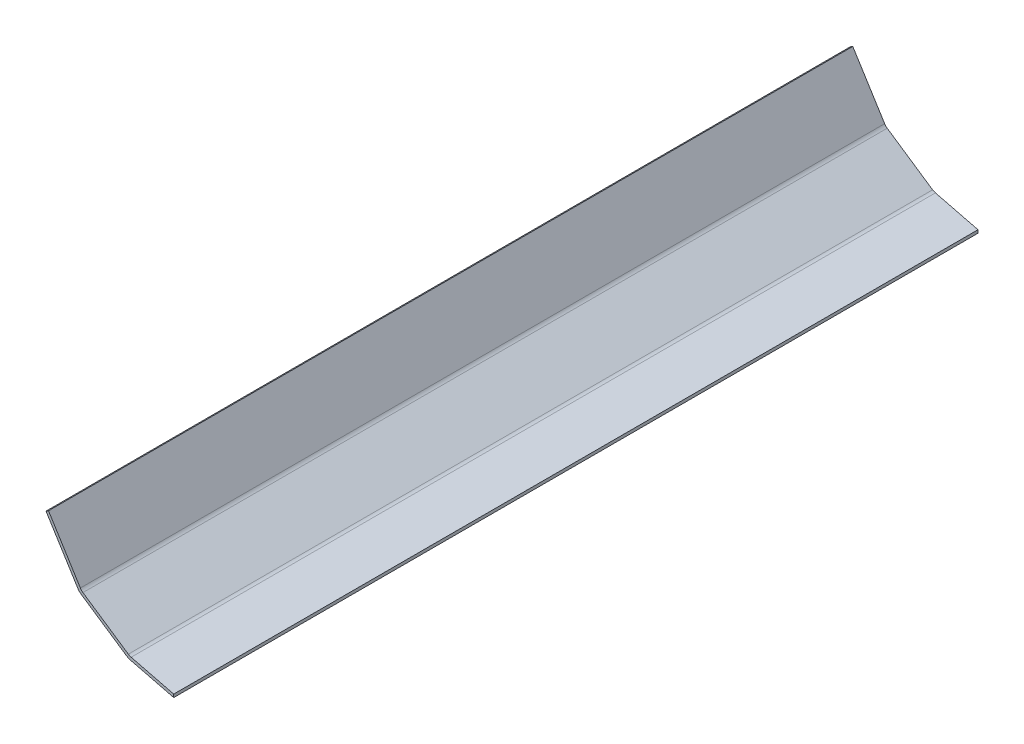
ISO-10303-21;
HEADER;
FILE_DESCRIPTION(('STEP AP214'),'2;1');
FILE_NAME('part.step','',(''),(''),'','','');
FILE_SCHEMA(('AUTOMOTIVE_DESIGN { 1 0 10303 214 1 1 1 1 }'));
ENDSEC;
DATA;
#1=APPLICATION_CONTEXT('core data for automotive mechanical design processes');
#2=APPLICATION_PROTOCOL_DEFINITION('international standard','automotive_design',2000,#1);
#3=PRODUCT_CONTEXT('',#1,'mechanical');
#4=PRODUCT('Part','Part','',(#3));
#5=PRODUCT_RELATED_PRODUCT_CATEGORY('part','',(#4));
#6=PRODUCT_DEFINITION_FORMATION('','',#4);
#7=PRODUCT_DEFINITION_CONTEXT('part definition',#1,'design');
#8=PRODUCT_DEFINITION('design','',#6,#7);
#9=PRODUCT_DEFINITION_SHAPE('','',#8);
#10=(LENGTH_UNIT() NAMED_UNIT(*) SI_UNIT(.MILLI.,.METRE.));
#11=(NAMED_UNIT(*) PLANE_ANGLE_UNIT() SI_UNIT($,.RADIAN.));
#12=(NAMED_UNIT(*) SI_UNIT($,.STERADIAN.) SOLID_ANGLE_UNIT());
#13=UNCERTAINTY_MEASURE_WITH_UNIT(LENGTH_MEASURE(1.E-05),#10,'distance_accuracy_value','');
#14=(GEOMETRIC_REPRESENTATION_CONTEXT(3) GLOBAL_UNCERTAINTY_ASSIGNED_CONTEXT((#13)) GLOBAL_UNIT_ASSIGNED_CONTEXT((#10,
#11,#12)) REPRESENTATION_CONTEXT('',''));
#15=CARTESIAN_POINT('',(0.,0.,0.));
#16=DIRECTION('',(0.,0.,1.));
#17=DIRECTION('',(1.,0.,0.));
#18=AXIS2_PLACEMENT_3D('',#15,#16,#17);
#19=CARTESIAN_POINT('',(135.5,2.060748754,272.));
#20=DIRECTION('',(-1.,0.,0.));
#21=DIRECTION('',(0.,0.,1.));
#22=AXIS2_PLACEMENT_3D('',#19,#20,#21);
#23=PLANE('',#22);
#24=DIRECTION('',(0.,1.,0.));
#25=VECTOR('',#24,1.);
#26=CARTESIAN_POINT('',(135.5,2.060748754,0.));
#27=LINE('',#26,#25);
#28=CARTESIAN_POINT('',(135.5,2.060748754,0.));
#29=VERTEX_POINT('',#28);
#30=CARTESIAN_POINT('',(135.5,3.091362383,0.));
#31=VERTEX_POINT('',#30);
#32=EDGE_CURVE('E172',#29,#31,#27,.T.);
#33=ORIENTED_EDGE('',*,*,#32,.T.);
#34=DIRECTION('',(0.,0.,-1.));
#35=VECTOR('',#34,1.);
#36=CARTESIAN_POINT('',(135.5,3.091362383,272.));
#37=LINE('',#36,#35);
#38=CARTESIAN_POINT('',(135.5,3.091362383,272.));
#39=VERTEX_POINT('',#38);
#40=EDGE_CURVE('E11',#39,#31,#37,.T.);
#41=ORIENTED_EDGE('',*,*,#40,.F.);
#42=DIRECTION('',(0.,1.,0.));
#43=VECTOR('',#42,1.);
#44=CARTESIAN_POINT('',(135.5,2.060748754,272.));
#45=LINE('',#44,#43);
#46=CARTESIAN_POINT('',(135.5,2.060748754,272.));
#47=VERTEX_POINT('',#46);
#48=EDGE_CURVE('E205',#47,#39,#45,.T.);
#49=ORIENTED_EDGE('',*,*,#48,.F.);
#50=DIRECTION('',(0.,0.,-1.));
#51=VECTOR('',#50,1.);
#52=CARTESIAN_POINT('',(135.5,2.060748754,272.));
#53=LINE('',#52,#51);
#54=EDGE_CURVE('E168',#47,#29,#53,.T.);
#55=ORIENTED_EDGE('',*,*,#54,.T.);
#56=EDGE_LOOP('',(#33,#41,#49,#55));
#57=FACE_BOUND('',#56,.T.);
#58=ADVANCED_FACE('F45',(#57),#23,.F.);
#59=CARTESIAN_POINT('',(135.5,3.091362383,272.));
#60=DIRECTION('',(-0.241921895633439,-0.970295726267577,0.));
#61=DIRECTION('',(0.970295726267577,-0.241921895633439,0.));
#62=AXIS2_PLACEMENT_3D('',#59,#60,#61);
#63=PLANE('',#62);
#64=DIRECTION('',(-0.970295726267577,0.241921895633439,0.));
#65=VECTOR('',#64,1.);
#66=CARTESIAN_POINT('',(135.5,3.091362383,0.));
#67=LINE('',#66,#65);
#68=CARTESIAN_POINT('',(121.100256736,6.681621613,0.));
#69=VERTEX_POINT('',#68);
#70=EDGE_CURVE('E176',#31,#69,#67,.T.);
#71=ORIENTED_EDGE('',*,*,#70,.T.);
#72=DIRECTION('',(0.,0.,-1.));
#73=VECTOR('',#72,1.);
#74=CARTESIAN_POINT('',(121.100256736,6.681621613,272.));
#75=LINE('',#74,#73);
#76=CARTESIAN_POINT('',(121.100256736,6.681621613,272.));
#77=VERTEX_POINT('',#76);
#78=EDGE_CURVE('E54',#77,#69,#75,.T.);
#79=ORIENTED_EDGE('',*,*,#78,.F.);
#80=DIRECTION('',(-0.970295726267577,0.241921895633439,0.));
#81=VECTOR('',#80,1.);
#82=CARTESIAN_POINT('',(135.5,3.091362383,272.));
#83=LINE('',#82,#81);
#84=EDGE_CURVE('E117',#39,#77,#83,.T.);
#85=ORIENTED_EDGE('',*,*,#84,.F.);
#86=ORIENTED_EDGE('',*,*,#40,.T.);
#87=EDGE_LOOP('',(#71,#79,#85,#86));
#88=FACE_BOUND('',#87,.T.);
#89=ADVANCED_FACE('F282',(#88),#63,.F.);
#90=CARTESIAN_POINT('',(121.826022433684,9.59250881876229,272.));
#91=DIRECTION('',(0.,0.,-1.));
#92=DIRECTION('',(-1.,0.,0.));
#93=AXIS2_PLACEMENT_3D('',#90,#91,#92);
#94=CYLINDRICAL_SURFACE('',#93,3.00000002876748);
#95=CARTESIAN_POINT('',(121.826022433684,9.59250881876229,0.));
#96=DIRECTION('',(0.,0.,-1.));
#97=DIRECTION('',(-1.,0.,0.));
#98=AXIS2_PLACEMENT_3D('',#95,#96,#97);
#99=CIRCLE('',#98,3.00000002876748);
#100=CARTESIAN_POINT('',(120.148443712,7.105396074,0.));
#101=VERTEX_POINT('',#100);
#102=EDGE_CURVE('E178',#69,#101,#99,.T.);
#103=ORIENTED_EDGE('',*,*,#102,.T.);
#104=DIRECTION('',(0.,0.,-1.));
#105=VECTOR('',#104,1.);
#106=CARTESIAN_POINT('',(120.148443712,7.105396074,272.));
#107=LINE('',#106,#105);
#108=CARTESIAN_POINT('',(120.148443712,7.105396074,272.));
#109=VERTEX_POINT('',#108);
#110=EDGE_CURVE('E231',#109,#101,#107,.T.);
#111=ORIENTED_EDGE('',*,*,#110,.F.);
#112=CARTESIAN_POINT('',(121.826022433684,9.59250881876229,272.));
#113=DIRECTION('',(0.,0.,-1.));
#114=DIRECTION('',(-1.,0.,0.));
#115=AXIS2_PLACEMENT_3D('',#112,#113,#114);
#116=CIRCLE('',#115,3.00000002876748);
#117=EDGE_CURVE('E242',#77,#109,#116,.T.);
#118=ORIENTED_EDGE('',*,*,#117,.F.);
#119=ORIENTED_EDGE('',*,*,#78,.T.);
#120=EDGE_LOOP('',(#103,#111,#118,#119));
#121=FACE_BOUND('',#120,.T.);
#122=ADVANCED_FACE('F240',(#121),#94,.F.);
#123=CARTESIAN_POINT('',(120.148443712,7.105396074,272.));
#124=DIRECTION('',(-0.559192903466936,-0.829037572557612,0.));
#125=DIRECTION('',(0.829037572557612,-0.559192903466936,0.));
#126=AXIS2_PLACEMENT_3D('',#123,#124,#125);
#127=PLANE('',#126);
#128=DIRECTION('',(-0.829037572557612,0.559192903466936,0.));
#129=VECTOR('',#128,1.);
#130=CARTESIAN_POINT('',(120.148443712,7.105396074,0.));
#131=LINE('',#130,#129);
#132=CARTESIAN_POINT('',(104.793241848,17.462610509,0.));
#133=VERTEX_POINT('',#132);
#134=EDGE_CURVE('E181',#101,#133,#131,.T.);
#135=ORIENTED_EDGE('',*,*,#134,.T.);
#136=DIRECTION('',(0.,0.,-1.));
#137=VECTOR('',#136,1.);
#138=CARTESIAN_POINT('',(104.793241848,17.462610509,272.));
#139=LINE('',#138,#137);
#140=CARTESIAN_POINT('',(104.793241848,17.462610509,272.));
#141=VERTEX_POINT('',#140);
#142=EDGE_CURVE('E227',#141,#133,#139,.T.);
#143=ORIENTED_EDGE('',*,*,#142,.F.);
#144=DIRECTION('',(-0.829037572557612,0.559192903466936,0.));
#145=VECTOR('',#144,1.);
#146=CARTESIAN_POINT('',(120.148443712,7.105396074,272.));
#147=LINE('',#146,#145);
#148=EDGE_CURVE('E261',#109,#141,#147,.T.);
#149=ORIENTED_EDGE('',*,*,#148,.F.);
#150=ORIENTED_EDGE('',*,*,#110,.T.);
#151=EDGE_LOOP('',(#135,#143,#149,#150));
#152=FACE_BOUND('',#151,.T.);
#153=ADVANCED_FACE('F251',(#152),#127,.F.);
#154=CARTESIAN_POINT('',(106.470820565133,19.9497232329328,272.));
#155=DIRECTION('',(0.,0.,-1.));
#156=DIRECTION('',(-1.,0.,0.));
#157=AXIS2_PLACEMENT_3D('',#154,#155,#156);
#158=CYLINDRICAL_SURFACE('',#157,3.00000000895456);
#159=CARTESIAN_POINT('',(106.470820565133,19.9497232329328,0.));
#160=DIRECTION('',(0.,0.,-1.));
#161=DIRECTION('',(-1.,0.,0.));
#162=AXIS2_PLACEMENT_3D('',#159,#160,#161);
#163=CIRCLE('',#162,3.00000000895456);
#164=CARTESIAN_POINT('',(103.92667627,18.359965434,0.));
#165=VERTEX_POINT('',#164);
#166=EDGE_CURVE('E184',#133,#165,#163,.T.);
#167=ORIENTED_EDGE('',*,*,#166,.T.);
#168=DIRECTION('',(0.,0.,-1.));
#169=VECTOR('',#168,1.);
#170=CARTESIAN_POINT('',(103.92667627,18.359965434,272.));
#171=LINE('',#170,#169);
#172=CARTESIAN_POINT('',(103.92667627,18.359965434,272.));
#173=VERTEX_POINT('',#172);
#174=EDGE_CURVE('E223',#173,#165,#171,.T.);
#175=ORIENTED_EDGE('',*,*,#174,.F.);
#176=CARTESIAN_POINT('',(106.470820565133,19.9497232329328,272.));
#177=DIRECTION('',(0.,0.,-1.));
#178=DIRECTION('',(-1.,0.,0.));
#179=AXIS2_PLACEMENT_3D('',#176,#177,#178);
#180=CIRCLE('',#179,3.00000000895456);
#181=EDGE_CURVE('E257',#141,#173,#180,.T.);
#182=ORIENTED_EDGE('',*,*,#181,.F.);
#183=ORIENTED_EDGE('',*,*,#142,.T.);
#184=EDGE_LOOP('',(#167,#175,#182,#183));
#185=FACE_BOUND('',#184,.T.);
#186=ADVANCED_FACE('F255',(#185),#158,.F.);
#187=CARTESIAN_POINT('',(103.92667627,18.359965434,272.));
#188=DIRECTION('',(-0.848048096172864,-0.529919264206898,0.));
#189=DIRECTION('',(0.529919264206898,-0.848048096172864,0.));
#190=AXIS2_PLACEMENT_3D('',#187,#188,#189);
#191=PLANE('',#190);
#192=DIRECTION('',(-0.529919264206898,0.848048096172864,0.));
#193=VECTOR('',#192,1.);
#194=CARTESIAN_POINT('',(103.92667627,18.359965434,0.));
#195=LINE('',#194,#193);
#196=CARTESIAN_POINT('',(93.151951904,35.603128879,0.));
#197=VERTEX_POINT('',#196);
#198=EDGE_CURVE('E187',#165,#197,#195,.T.);
#199=ORIENTED_EDGE('',*,*,#198,.T.);
#200=DIRECTION('',(0.,0.,-1.));
#201=VECTOR('',#200,1.);
#202=CARTESIAN_POINT('',(93.151951904,35.603128879,272.));
#203=LINE('',#202,#201);
#204=CARTESIAN_POINT('',(93.151951904,35.603128879,272.));
#205=VERTEX_POINT('',#204);
#206=EDGE_CURVE('E219',#205,#197,#203,.T.);
#207=ORIENTED_EDGE('',*,*,#206,.F.);
#208=DIRECTION('',(-0.529919264206898,0.848048096172864,0.));
#209=VECTOR('',#208,1.);
#210=CARTESIAN_POINT('',(103.92667627,18.359965434,272.));
#211=LINE('',#210,#209);
#212=EDGE_CURVE('E260',#173,#205,#211,.T.);
#213=ORIENTED_EDGE('',*,*,#212,.F.);
#214=ORIENTED_EDGE('',*,*,#174,.T.);
#215=EDGE_LOOP('',(#199,#207,#213,#214));
#216=FACE_BOUND('',#215,.T.);
#217=ADVANCED_FACE('F293',(#216),#191,.F.);
#218=CARTESIAN_POINT('',(93.151951904,35.603128879,272.));
#219=DIRECTION('',(0.529919264854981,-0.848048095767897,0.));
#220=DIRECTION('',(0.848048095767897,0.529919264854981,0.));
#221=AXIS2_PLACEMENT_3D('',#218,#219,#220);
#222=PLANE('',#221);
#223=DIRECTION('',(-0.848048095767897,-0.529919264854981,0.));
#224=VECTOR('',#223,1.);
#225=CARTESIAN_POINT('',(93.151951904,35.603128879,0.));
#226=LINE('',#225,#224);
#227=CARTESIAN_POINT('',(92.3039038079277,35.0732096139548,0.));
#228=VERTEX_POINT('',#227);
#229=EDGE_CURVE('E190',#197,#228,#226,.T.);
#230=ORIENTED_EDGE('',*,*,#229,.T.);
#231=DIRECTION('',(0.,0.,-1.));
#232=VECTOR('',#231,1.);
#233=CARTESIAN_POINT('',(92.3039038079277,35.0732096139548,272.));
#234=LINE('',#233,#232);
#235=CARTESIAN_POINT('',(92.3039038079277,35.0732096139548,272.));
#236=VERTEX_POINT('',#235);
#237=EDGE_CURVE('E215',#236,#228,#234,.T.);
#238=ORIENTED_EDGE('',*,*,#237,.F.);
#239=DIRECTION('',(-0.848048095767897,-0.529919264854981,0.));
#240=VECTOR('',#239,1.);
#241=CARTESIAN_POINT('',(93.151951904,35.603128879,272.));
#242=LINE('',#241,#240);
#243=EDGE_CURVE('E265',#205,#236,#242,.T.);
#244=ORIENTED_EDGE('',*,*,#243,.F.);
#245=ORIENTED_EDGE('',*,*,#206,.T.);
#246=EDGE_LOOP('',(#230,#238,#244,#245));
#247=FACE_BOUND('',#246,.T.);
#248=ADVANCED_FACE('F296',(#247),#222,.F.);
#249=CARTESIAN_POINT('',(92.3039038079277,35.0732096139548,272.));
#250=DIRECTION('',(0.848048096159054,0.529919264229,0.));
#251=DIRECTION('',(-0.529919264229,0.848048096159054,0.));
#252=AXIS2_PLACEMENT_3D('',#249,#250,#251);
#253=PLANE('',#252);
#254=DIRECTION('',(0.529919264229,-0.848048096159054,0.));
#255=VECTOR('',#254,1.);
#256=CARTESIAN_POINT('',(92.3039038079277,35.0732096139548,0.));
#257=LINE('',#256,#255);
#258=CARTESIAN_POINT('',(103.078628173928,17.8300461699548,0.));
#259=VERTEX_POINT('',#258);
#260=EDGE_CURVE('E193',#228,#259,#257,.T.);
#261=ORIENTED_EDGE('',*,*,#260,.T.);
#262=DIRECTION('',(0.,0.,-1.));
#263=VECTOR('',#262,1.);
#264=CARTESIAN_POINT('',(103.078628173928,17.8300461699548,272.));
#265=LINE('',#264,#263);
#266=CARTESIAN_POINT('',(103.078628173928,17.8300461699548,272.));
#267=VERTEX_POINT('',#266);
#268=EDGE_CURVE('E211',#267,#259,#265,.T.);
#269=ORIENTED_EDGE('',*,*,#268,.F.);
#270=DIRECTION('',(0.529919264229,-0.848048096159054,0.));
#271=VECTOR('',#270,1.);
#272=CARTESIAN_POINT('',(92.3039038079277,35.0732096139548,272.));
#273=LINE('',#272,#271);
#274=EDGE_CURVE('E272',#236,#267,#273,.T.);
#275=ORIENTED_EDGE('',*,*,#274,.F.);
#276=ORIENTED_EDGE('',*,*,#237,.T.);
#277=EDGE_LOOP('',(#261,#269,#275,#276));
#278=FACE_BOUND('',#277,.T.);
#279=ADVANCED_FACE('F300',(#278),#253,.F.);
#280=CARTESIAN_POINT('',(106.470820565133,19.9497232329328,272.));
#281=DIRECTION('',(0.,0.,-1.));
#282=DIRECTION('',(-1.,0.,0.));
#283=AXIS2_PLACEMENT_3D('',#280,#281,#282);
#284=CYLINDRICAL_SURFACE('',#283,4.0000000087836);
#285=CARTESIAN_POINT('',(106.470820565133,19.9497232329328,0.));
#286=DIRECTION('',(0.,0.,1.));
#287=DIRECTION('',(1.,0.,0.));
#288=AXIS2_PLACEMENT_3D('',#285,#286,#287);
#289=CIRCLE('',#288,4.0000000087836);
#290=CARTESIAN_POINT('',(104.234048944691,16.633572936542,0.));
#291=VERTEX_POINT('',#290);
#292=EDGE_CURVE('E196',#259,#291,#289,.T.);
#293=ORIENTED_EDGE('',*,*,#292,.T.);
#294=DIRECTION('',(0.,0.,-1.));
#295=VECTOR('',#294,1.);
#296=CARTESIAN_POINT('',(104.234048944691,16.633572936542,272.));
#297=LINE('',#296,#295);
#298=CARTESIAN_POINT('',(104.234048944691,16.633572936542,272.));
#299=VERTEX_POINT('',#298);
#300=EDGE_CURVE('E159',#299,#291,#297,.T.);
#301=ORIENTED_EDGE('',*,*,#300,.F.);
#302=CARTESIAN_POINT('',(106.470820565133,19.9497232329328,272.));
#303=DIRECTION('',(0.,0.,1.));
#304=DIRECTION('',(1.,0.,0.));
#305=AXIS2_PLACEMENT_3D('',#302,#303,#304);
#306=CIRCLE('',#305,4.0000000087836);
#307=EDGE_CURVE('E148',#267,#299,#306,.T.);
#308=ORIENTED_EDGE('',*,*,#307,.F.);
#309=ORIENTED_EDGE('',*,*,#268,.T.);
#310=EDGE_LOOP('',(#293,#301,#308,#309));
#311=FACE_BOUND('',#310,.T.);
#312=ADVANCED_FACE('F304',(#311),#284,.T.);
#313=CARTESIAN_POINT('',(104.234048944691,16.633572936542,272.));
#314=DIRECTION('',(0.559192903466936,0.829037572557612,0.));
#315=DIRECTION('',(-0.829037572557612,0.559192903466936,0.));
#316=AXIS2_PLACEMENT_3D('',#313,#314,#315);
#317=PLANE('',#316);
#318=DIRECTION('',(0.829037572557612,-0.559192903466936,0.));
#319=VECTOR('',#318,1.);
#320=CARTESIAN_POINT('',(104.234048944691,16.633572936542,0.));
#321=LINE('',#320,#319);
#322=CARTESIAN_POINT('',(119.589250808691,6.27635850154201,0.));
#323=VERTEX_POINT('',#322);
#324=EDGE_CURVE('E157',#291,#323,#321,.T.);
#325=ORIENTED_EDGE('',*,*,#324,.T.);
#326=DIRECTION('',(0.,0.,-1.));
#327=VECTOR('',#326,1.);
#328=CARTESIAN_POINT('',(119.589250808691,6.27635850154201,272.));
#329=LINE('',#328,#327);
#330=CARTESIAN_POINT('',(119.589250808691,6.27635850154201,272.));
#331=VERTEX_POINT('',#330);
#332=EDGE_CURVE('E154',#331,#323,#329,.T.);
#333=ORIENTED_EDGE('',*,*,#332,.F.);
#334=DIRECTION('',(0.829037572557612,-0.559192903466936,0.));
#335=VECTOR('',#334,1.);
#336=CARTESIAN_POINT('',(104.234048944691,16.633572936542,272.));
#337=LINE('',#336,#335);
#338=EDGE_CURVE('E142',#299,#331,#337,.T.);
#339=ORIENTED_EDGE('',*,*,#338,.F.);
#340=ORIENTED_EDGE('',*,*,#300,.T.);
#341=EDGE_LOOP('',(#325,#333,#339,#340));
#342=FACE_BOUND('',#341,.T.);
#343=ADVANCED_FACE('F155',(#342),#317,.F.);
#344=CARTESIAN_POINT('',(121.826022433684,9.59250881876229,272.));
#345=DIRECTION('',(0.,0.,-1.));
#346=DIRECTION('',(-1.,0.,0.));
#347=AXIS2_PLACEMENT_3D('',#344,#345,#346);
#348=CYLINDRICAL_SURFACE('',#347,4.00000002859653);
#349=CARTESIAN_POINT('',(121.826022433684,9.59250881876229,0.));
#350=DIRECTION('',(0.,0.,1.));
#351=DIRECTION('',(1.,0.,0.));
#352=AXIS2_PLACEMENT_3D('',#349,#350,#351);
#353=CIRCLE('',#352,4.00000002859653);
#354=CARTESIAN_POINT('',(120.85833484,5.711325887,0.));
#355=VERTEX_POINT('',#354);
#356=EDGE_CURVE('E103',#323,#355,#353,.T.);
#357=ORIENTED_EDGE('',*,*,#356,.T.);
#358=DIRECTION('',(0.,0.,-1.));
#359=VECTOR('',#358,1.);
#360=CARTESIAN_POINT('',(120.85833484,5.711325887,272.));
#361=LINE('',#360,#359);
#362=CARTESIAN_POINT('',(120.85833484,5.711325887,272.));
#363=VERTEX_POINT('',#362);
#364=EDGE_CURVE('E160',#363,#355,#361,.T.);
#365=ORIENTED_EDGE('',*,*,#364,.F.);
#366=CARTESIAN_POINT('',(121.826022433684,9.59250881876229,272.));
#367=DIRECTION('',(0.,0.,1.));
#368=DIRECTION('',(1.,0.,0.));
#369=AXIS2_PLACEMENT_3D('',#366,#367,#368);
#370=CIRCLE('',#369,4.00000002859653);
#371=EDGE_CURVE('E146',#331,#363,#370,.T.);
#372=ORIENTED_EDGE('',*,*,#371,.F.);
#373=ORIENTED_EDGE('',*,*,#332,.T.);
#374=EDGE_LOOP('',(#357,#365,#372,#373));
#375=FACE_BOUND('',#374,.T.);
#376=ADVANCED_FACE('F162',(#375),#348,.T.);
#377=CARTESIAN_POINT('',(120.85833484,5.711325887,272.));
#378=DIRECTION('',(0.241921895622042,0.970295726270418,0.));
#379=DIRECTION('',(-0.970295726270418,0.241921895622042,0.));
#380=AXIS2_PLACEMENT_3D('',#377,#378,#379);
#381=PLANE('',#380);
#382=DIRECTION('',(0.970295726270418,-0.241921895622042,0.));
#383=VECTOR('',#382,1.);
#384=CARTESIAN_POINT('',(120.85833484,5.711325887,0.));
#385=LINE('',#384,#383);
#386=EDGE_CURVE('E109',#355,#29,#385,.T.);
#387=ORIENTED_EDGE('',*,*,#386,.T.);
#388=ORIENTED_EDGE('',*,*,#54,.F.);
#389=DIRECTION('',(0.970295726270418,-0.241921895622042,0.));
#390=VECTOR('',#389,1.);
#391=CARTESIAN_POINT('',(120.85833484,5.711325887,272.));
#392=LINE('',#391,#390);
#393=EDGE_CURVE('E62',#363,#47,#392,.T.);
#394=ORIENTED_EDGE('',*,*,#393,.F.);
#395=ORIENTED_EDGE('',*,*,#364,.T.);
#396=EDGE_LOOP('',(#387,#388,#394,#395));
#397=FACE_BOUND('',#396,.T.);
#398=ADVANCED_FACE('F313',(#397),#381,.F.);
#399=CARTESIAN_POINT('',(121.826022433684,9.59250881876229,272.));
#400=DIRECTION('',(0.,0.,-1.));
#401=DIRECTION('',(-1.,0.,0.));
#402=AXIS2_PLACEMENT_3D('',#399,#400,#401);
#403=PLANE('',#402);
#404=ORIENTED_EDGE('',*,*,#48,.T.);
#405=ORIENTED_EDGE('',*,*,#84,.T.);
#406=ORIENTED_EDGE('',*,*,#117,.T.);
#407=ORIENTED_EDGE('',*,*,#148,.T.);
#408=ORIENTED_EDGE('',*,*,#181,.T.);
#409=ORIENTED_EDGE('',*,*,#212,.T.);
#410=ORIENTED_EDGE('',*,*,#243,.T.);
#411=ORIENTED_EDGE('',*,*,#274,.T.);
#412=ORIENTED_EDGE('',*,*,#307,.T.);
#413=ORIENTED_EDGE('',*,*,#338,.T.);
#414=ORIENTED_EDGE('',*,*,#371,.T.);
#415=ORIENTED_EDGE('',*,*,#393,.T.);
#416=EDGE_LOOP('',(#404,#405,#406,#407,#408,#409,#410,#411,#412,#413,#414,#415));
#417=FACE_BOUND('',#416,.T.);
#418=ADVANCED_FACE('F144',(#417),#403,.F.);
#419=CARTESIAN_POINT('',(121.826022433684,9.59250881876229,0.));
#420=DIRECTION('',(0.,0.,-1.));
#421=DIRECTION('',(-1.,0.,0.));
#422=AXIS2_PLACEMENT_3D('',#419,#420,#421);
#423=PLANE('',#422);
#424=ORIENTED_EDGE('',*,*,#32,.F.);
#425=ORIENTED_EDGE('',*,*,#386,.F.);
#426=ORIENTED_EDGE('',*,*,#356,.F.);
#427=ORIENTED_EDGE('',*,*,#324,.F.);
#428=ORIENTED_EDGE('',*,*,#292,.F.);
#429=ORIENTED_EDGE('',*,*,#260,.F.);
#430=ORIENTED_EDGE('',*,*,#229,.F.);
#431=ORIENTED_EDGE('',*,*,#198,.F.);
#432=ORIENTED_EDGE('',*,*,#166,.F.);
#433=ORIENTED_EDGE('',*,*,#134,.F.);
#434=ORIENTED_EDGE('',*,*,#102,.F.);
#435=ORIENTED_EDGE('',*,*,#70,.F.);
#436=EDGE_LOOP('',(#424,#425,#426,#427,#428,#429,#430,#431,#432,#433,#434,#435));
#437=FACE_BOUND('',#436,.T.);
#438=ADVANCED_FACE('F246',(#437),#423,.T.);
#439=CLOSED_SHELL('',(#58,#89,#122,#153,#186,#217,#248,#279,#312,#343,#376,#398,#418,#438));
#440=MANIFOLD_SOLID_BREP('B2',#439);
#441=ADVANCED_BREP_SHAPE_REPRESENTATION('',(#18,#440),#14);
#442=SHAPE_DEFINITION_REPRESENTATION(#9,#441);
ENDSEC;
END-ISO-10303-21;
